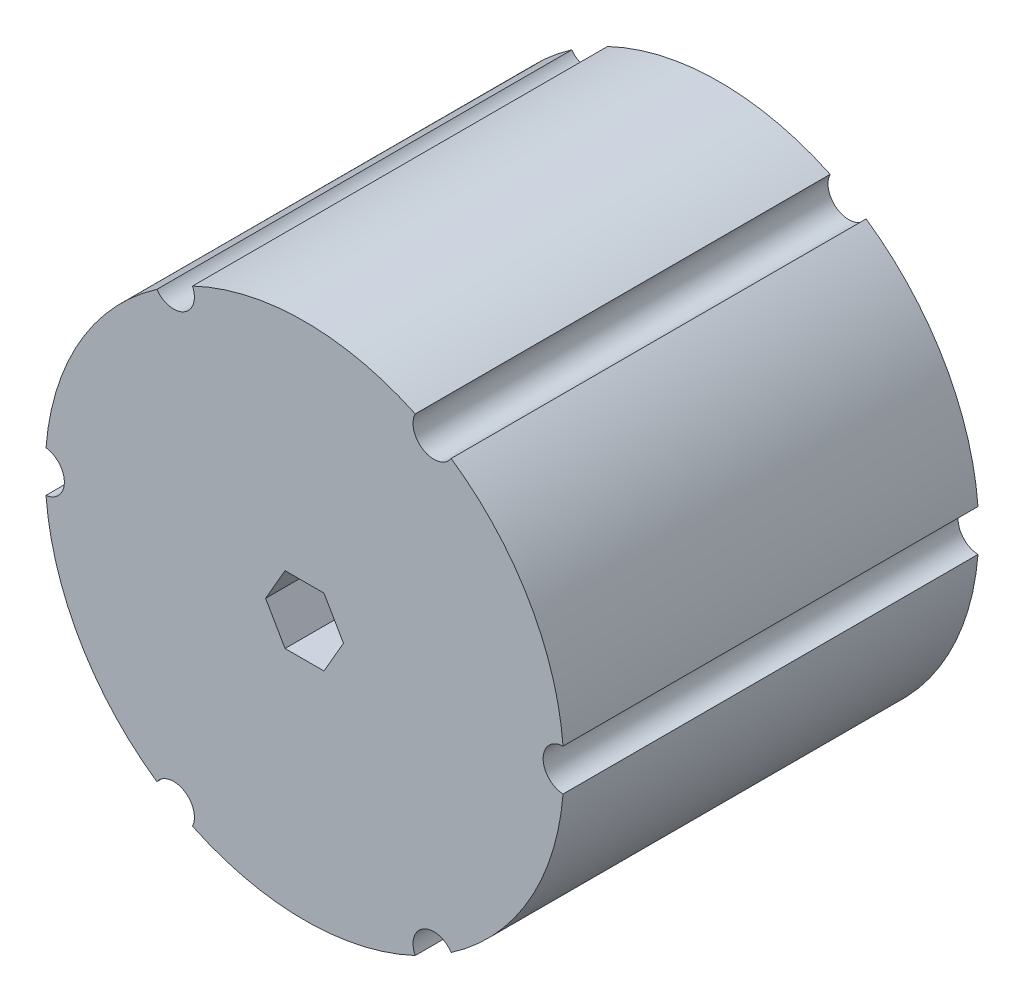
ISO-10303-21;
HEADER;
FILE_DESCRIPTION(('STEP AP214'),'2;1');
FILE_NAME('part.step','',(''),(''),'','','');
FILE_SCHEMA(('AUTOMOTIVE_DESIGN { 1 0 10303 214 1 1 1 1 }'));
ENDSEC;
DATA;
#1=APPLICATION_CONTEXT('core data for automotive mechanical design processes');
#2=APPLICATION_PROTOCOL_DEFINITION('international standard','automotive_design',2000,#1);
#3=PRODUCT_CONTEXT('',#1,'mechanical');
#4=PRODUCT('Part','Part','',(#3));
#5=PRODUCT_RELATED_PRODUCT_CATEGORY('part','',(#4));
#6=PRODUCT_DEFINITION_FORMATION('','',#4);
#7=PRODUCT_DEFINITION_CONTEXT('part definition',#1,'design');
#8=PRODUCT_DEFINITION('design','',#6,#7);
#9=PRODUCT_DEFINITION_SHAPE('','',#8);
#10=(LENGTH_UNIT() NAMED_UNIT(*) SI_UNIT(.MILLI.,.METRE.));
#11=(NAMED_UNIT(*) PLANE_ANGLE_UNIT() SI_UNIT($,.RADIAN.));
#12=(NAMED_UNIT(*) SI_UNIT($,.STERADIAN.) SOLID_ANGLE_UNIT());
#13=UNCERTAINTY_MEASURE_WITH_UNIT(LENGTH_MEASURE(1.E-05),#10,'distance_accuracy_value','');
#14=(GEOMETRIC_REPRESENTATION_CONTEXT(3) GLOBAL_UNCERTAINTY_ASSIGNED_CONTEXT((#13)) GLOBAL_UNIT_ASSIGNED_CONTEXT((#10,
#11,#12)) REPRESENTATION_CONTEXT('',''));
#15=CARTESIAN_POINT('',(0.,0.,0.));
#16=DIRECTION('',(0.,0.,1.));
#17=DIRECTION('',(1.,0.,0.));
#18=AXIS2_PLACEMENT_3D('',#15,#16,#17);
#19=CARTESIAN_POINT('',(0.,0.,-40.));
#20=DIRECTION('',(0.,0.,1.));
#21=DIRECTION('',(1.,0.,0.));
#22=AXIS2_PLACEMENT_3D('',#19,#20,#21);
#23=CYLINDRICAL_SURFACE('',#22,25.);
#24=CARTESIAN_POINT('',(0.,0.,0.));
#25=DIRECTION('',(0.,0.,1.));
#26=DIRECTION('',(1.,0.,0.));
#27=AXIS2_PLACEMENT_3D('',#24,#25,#26);
#28=CIRCLE('',#27,25.);
#29=CARTESIAN_POINT('',(14.1348332513501,-20.620535612746,0.));
#30=VERTEX_POINT('',#29);
#31=CARTESIAN_POINT('',(24.92,-1.99839935948751,0.));
#32=VERTEX_POINT('',#31);
#33=EDGE_CURVE('E272',#30,#32,#28,.T.);
#34=ORIENTED_EDGE('',*,*,#33,.F.);
#35=DIRECTION('',(0.,0.,-1.));
#36=VECTOR('',#35,1.);
#37=CARTESIAN_POINT('',(14.1348332513501,-20.620535612746,-101.488964917374));
#38=LINE('',#37,#36);
#39=CARTESIAN_POINT('',(14.1348332513501,-20.620535612746,-40.));
#40=VERTEX_POINT('',#39);
#41=EDGE_CURVE('E225',#30,#40,#38,.T.);
#42=ORIENTED_EDGE('',*,*,#41,.T.);
#43=CARTESIAN_POINT('',(0.,0.,-40.));
#44=DIRECTION('',(0.,0.,1.));
#45=DIRECTION('',(1.,0.,0.));
#46=AXIS2_PLACEMENT_3D('',#43,#44,#45);
#47=CIRCLE('',#46,25.);
#48=CARTESIAN_POINT('',(24.92,-1.99839935948751,-40.));
#49=VERTEX_POINT('',#48);
#50=EDGE_CURVE('E278',#40,#49,#47,.T.);
#51=ORIENTED_EDGE('',*,*,#50,.T.);
#52=DIRECTION('',(0.,0.,-1.));
#53=VECTOR('',#52,1.);
#54=CARTESIAN_POINT('',(24.92,-1.99839935948749,0.));
#55=LINE('',#54,#53);
#56=EDGE_CURVE('E264',#32,#49,#55,.T.);
#57=ORIENTED_EDGE('',*,*,#56,.F.);
#58=EDGE_LOOP('',(#34,#42,#51,#57));
#59=FACE_BOUND('',#58,.T.);
#60=ADVANCED_FACE('F39',(#59),#23,.T.);
#61=CARTESIAN_POINT('',(-10.7956660067427,-22.5489156162964,-40.));
#62=VERTEX_POINT('',#61);
#63=CARTESIAN_POINT('',(10.6715203746854,-22.6079334060562,-40.));
#64=VERTEX_POINT('',#63);
#65=EDGE_CURVE('E300',#62,#64,#47,.T.);
#66=ORIENTED_EDGE('',*,*,#65,.T.);
#67=DIRECTION('',(0.,0.,-1.));
#68=VECTOR('',#67,1.);
#69=CARTESIAN_POINT('',(10.6715203746854,-22.6079334060562,-101.488964917374));
#70=LINE('',#69,#68);
#71=CARTESIAN_POINT('',(10.6715203746854,-22.6079334060562,0.));
#72=VERTEX_POINT('',#71);
#73=EDGE_CURVE('E223',#64,#72,#70,.F.);
#74=ORIENTED_EDGE('',*,*,#73,.T.);
#75=CARTESIAN_POINT('',(-10.7956660067427,-22.5489156162964,0.));
#76=VERTEX_POINT('',#75);
#77=EDGE_CURVE('E335',#76,#72,#28,.T.);
#78=ORIENTED_EDGE('',*,*,#77,.F.);
#79=DIRECTION('',(0.,0.,-1.));
#80=VECTOR('',#79,1.);
#81=CARTESIAN_POINT('',(-10.7956660067428,-22.5489156162964,-101.488964917374));
#82=LINE('',#81,#80);
#83=EDGE_CURVE('E233',#76,#62,#82,.T.);
#84=ORIENTED_EDGE('',*,*,#83,.T.);
#85=EDGE_LOOP('',(#66,#74,#78,#84));
#86=FACE_BOUND('',#85,.T.);
#87=ADVANCED_FACE('F339',(#86),#23,.T.);
#88=CARTESIAN_POINT('',(0.,0.,0.));
#89=DIRECTION('',(0.,0.,1.));
#90=DIRECTION('',(1.,0.,0.));
#91=AXIS2_PLACEMENT_3D('',#88,#89,#90);
#92=PLANE('',#91);
#93=DIRECTION('',(0.5,0.866025403784439,0.));
#94=VECTOR('',#93,1.);
#95=CARTESIAN_POINT('',(1.87638837486628,-3.25,0.));
#96=LINE('',#95,#94);
#97=CARTESIAN_POINT('',(1.87638837486628,-3.25,0.));
#98=VERTEX_POINT('',#97);
#99=CARTESIAN_POINT('',(3.75277674973257,0.,0.));
#100=VERTEX_POINT('',#99);
#101=EDGE_CURVE('E53',#98,#100,#96,.T.);
#102=ORIENTED_EDGE('',*,*,#101,.F.);
#103=DIRECTION('',(1.,0.,0.));
#104=VECTOR('',#103,1.);
#105=CARTESIAN_POINT('',(-1.87638837486628,-3.25,0.));
#106=LINE('',#105,#104);
#107=CARTESIAN_POINT('',(-1.87638837486628,-3.25,0.));
#108=VERTEX_POINT('',#107);
#109=EDGE_CURVE('E185',#108,#98,#106,.T.);
#110=ORIENTED_EDGE('',*,*,#109,.F.);
#111=DIRECTION('',(0.5,-0.866025403784439,0.));
#112=VECTOR('',#111,1.);
#113=CARTESIAN_POINT('',(-3.75277674973257,0.,0.));
#114=LINE('',#113,#112);
#115=CARTESIAN_POINT('',(-3.75277674973257,0.,0.));
#116=VERTEX_POINT('',#115);
#117=EDGE_CURVE('E188',#116,#108,#114,.T.);
#118=ORIENTED_EDGE('',*,*,#117,.F.);
#119=DIRECTION('',(-0.5,-0.866025403784439,0.));
#120=VECTOR('',#119,1.);
#121=CARTESIAN_POINT('',(-1.87638837486628,3.25,0.));
#122=LINE('',#121,#120);
#123=CARTESIAN_POINT('',(-1.87638837486628,3.25,0.));
#124=VERTEX_POINT('',#123);
#125=EDGE_CURVE('E208',#124,#116,#122,.T.);
#126=ORIENTED_EDGE('',*,*,#125,.F.);
#127=DIRECTION('',(-1.,0.,0.));
#128=VECTOR('',#127,1.);
#129=CARTESIAN_POINT('',(1.87638837486628,3.25,0.));
#130=LINE('',#129,#128);
#131=CARTESIAN_POINT('',(1.87638837486628,3.25,0.));
#132=VERTEX_POINT('',#131);
#133=EDGE_CURVE('E205',#132,#124,#130,.T.);
#134=ORIENTED_EDGE('',*,*,#133,.F.);
#135=DIRECTION('',(-0.5,0.866025403784439,0.));
#136=VECTOR('',#135,1.);
#137=CARTESIAN_POINT('',(3.75277674973257,0.,0.));
#138=LINE('',#137,#136);
#139=EDGE_CURVE('E202',#100,#132,#138,.T.);
#140=ORIENTED_EDGE('',*,*,#139,.F.);
#141=EDGE_LOOP('',(#102,#110,#118,#126,#134,#140));
#142=FACE_BOUND('',#141,.T.);
#143=CARTESIAN_POINT('',(12.4619168429844,-21.7165970574748,0.));
#144=DIRECTION('',(0.,0.,1.));
#145=DIRECTION('',(0.50000000000001,-0.866025403784433,0.));
#146=AXIS2_PLACEMENT_3D('',#143,#144,#145);
#147=CIRCLE('',#146,2.);
#148=EDGE_CURVE('E61',#30,#72,#147,.T.);
#149=ORIENTED_EDGE('',*,*,#148,.F.);
#150=ORIENTED_EDGE('',*,*,#33,.T.);
#151=CARTESIAN_POINT('',(25.,0.,0.));
#152=DIRECTION('',(0.,0.,1.));
#153=DIRECTION('',(1.,0.,0.));
#154=AXIS2_PLACEMENT_3D('',#151,#152,#153);
#155=CIRCLE('',#154,2.);
#156=CARTESIAN_POINT('',(24.92,1.99839935948751,0.));
#157=VERTEX_POINT('',#156);
#158=EDGE_CURVE('E261',#157,#32,#155,.T.);
#159=ORIENTED_EDGE('',*,*,#158,.F.);
#160=CARTESIAN_POINT('',(14.1348332513498,20.6205356127462,0.));
#161=VERTEX_POINT('',#160);
#162=EDGE_CURVE('E279',#157,#161,#28,.T.);
#163=ORIENTED_EDGE('',*,*,#162,.T.);
#164=CARTESIAN_POINT('',(12.4619168429841,21.7165970574749,0.));
#165=DIRECTION('',(0.,0.,1.));
#166=DIRECTION('',(0.499999999999998,0.86602540378444,0.));
#167=AXIS2_PLACEMENT_3D('',#164,#165,#166);
#168=CIRCLE('',#167,2.);
#169=CARTESIAN_POINT('',(10.6715203746851,22.6079334060563,0.));
#170=VERTEX_POINT('',#169);
#171=EDGE_CURVE('E252',#170,#161,#168,.T.);
#172=ORIENTED_EDGE('',*,*,#171,.F.);
#173=CARTESIAN_POINT('',(-10.795666006743,22.5489156162963,0.));
#174=VERTEX_POINT('',#173);
#175=EDGE_CURVE('E282',#170,#174,#28,.T.);
#176=ORIENTED_EDGE('',*,*,#175,.T.);
#177=CARTESIAN_POINT('',(-12.6142494710475,21.7165970574749,0.));
#178=DIRECTION('',(0.,0.,1.));
#179=DIRECTION('',(-0.500000000000004,0.866025403784436,0.));
#180=AXIS2_PLACEMENT_3D('',#177,#178,#179);
#181=CIRCLE('',#180,2.);
#182=CARTESIAN_POINT('',(-14.2382407554506,20.5492700646477,0.));
#183=VERTEX_POINT('',#182);
#184=EDGE_CURVE('E244',#183,#174,#181,.T.);
#185=ORIENTED_EDGE('',*,*,#184,.F.);
#186=CARTESIAN_POINT('',(-24.9209458059172,1.98656994302669,0.));
#187=VERTEX_POINT('',#186);
#188=EDGE_CURVE('E331',#183,#187,#28,.T.);
#189=ORIENTED_EDGE('',*,*,#188,.T.);
#190=CARTESIAN_POINT('',(-25.1523326280632,0.,0.));
#191=DIRECTION('',(0.,0.,1.));
#192=DIRECTION('',(-1.,0.,0.));
#193=AXIS2_PLACEMENT_3D('',#190,#191,#192);
#194=CIRCLE('',#193,2.);
#195=CARTESIAN_POINT('',(-24.9209458059172,-1.9865699430267,0.));
#196=VERTEX_POINT('',#195);
#197=EDGE_CURVE('E236',#196,#187,#194,.T.);
#198=ORIENTED_EDGE('',*,*,#197,.F.);
#199=CARTESIAN_POINT('',(-14.2382407554503,-20.5492700646479,0.));
#200=VERTEX_POINT('',#199);
#201=EDGE_CURVE('E333',#196,#200,#28,.T.);
#202=ORIENTED_EDGE('',*,*,#201,.T.);
#203=CARTESIAN_POINT('',(-12.6142494710472,-21.716597057475,0.));
#204=DIRECTION('',(0.,0.,1.));
#205=DIRECTION('',(-0.499999999999992,-0.866025403784443,0.));
#206=AXIS2_PLACEMENT_3D('',#203,#204,#205);
#207=CIRCLE('',#206,2.);
#208=EDGE_CURVE('E228',#76,#200,#207,.T.);
#209=ORIENTED_EDGE('',*,*,#208,.F.);
#210=ORIENTED_EDGE('',*,*,#77,.T.);
#211=EDGE_LOOP('',(#149,#150,#159,#163,#172,#176,#185,#189,#198,#202,#209,#210));
#212=FACE_BOUND('',#211,.T.);
#213=ADVANCED_FACE('F318',(#142,#212),#92,.T.);
#214=CARTESIAN_POINT('',(-24.9209458059172,-1.9865699430267,-40.));
#215=VERTEX_POINT('',#214);
#216=CARTESIAN_POINT('',(-14.2382407554503,-20.5492700646479,-40.));
#217=VERTEX_POINT('',#216);
#218=EDGE_CURVE('E298',#215,#217,#47,.T.);
#219=ORIENTED_EDGE('',*,*,#218,.T.);
#220=DIRECTION('',(0.,0.,-1.));
#221=VECTOR('',#220,1.);
#222=CARTESIAN_POINT('',(-14.2382407554502,-20.5492700646479,-101.488964917374));
#223=LINE('',#222,#221);
#224=EDGE_CURVE('E231',#217,#200,#223,.F.);
#225=ORIENTED_EDGE('',*,*,#224,.T.);
#226=ORIENTED_EDGE('',*,*,#201,.F.);
#227=DIRECTION('',(0.,0.,-1.));
#228=VECTOR('',#227,1.);
#229=CARTESIAN_POINT('',(-24.9209458059172,-1.98656994302672,-101.488964917374));
#230=LINE('',#229,#228);
#231=EDGE_CURVE('E241',#196,#215,#230,.T.);
#232=ORIENTED_EDGE('',*,*,#231,.T.);
#233=EDGE_LOOP('',(#219,#225,#226,#232));
#234=FACE_BOUND('',#233,.T.);
#235=ADVANCED_FACE('F302',(#234),#23,.T.);
#236=CARTESIAN_POINT('',(-14.2382407554506,20.5492700646477,-40.));
#237=VERTEX_POINT('',#236);
#238=CARTESIAN_POINT('',(-24.9209458059172,1.98656994302669,-40.));
#239=VERTEX_POINT('',#238);
#240=EDGE_CURVE('E306',#237,#239,#47,.T.);
#241=ORIENTED_EDGE('',*,*,#240,.T.);
#242=DIRECTION('',(0.,0.,-1.));
#243=VECTOR('',#242,1.);
#244=CARTESIAN_POINT('',(-24.9209458059172,1.98656994302672,-101.488964917374));
#245=LINE('',#244,#243);
#246=EDGE_CURVE('E239',#239,#187,#245,.F.);
#247=ORIENTED_EDGE('',*,*,#246,.T.);
#248=ORIENTED_EDGE('',*,*,#188,.F.);
#249=DIRECTION('',(0.,0.,-1.));
#250=VECTOR('',#249,1.);
#251=CARTESIAN_POINT('',(-14.2382407554505,20.5492700646477,-101.488964917374));
#252=LINE('',#251,#250);
#253=EDGE_CURVE('E249',#183,#237,#252,.T.);
#254=ORIENTED_EDGE('',*,*,#253,.T.);
#255=EDGE_LOOP('',(#241,#247,#248,#254));
#256=FACE_BOUND('',#255,.T.);
#257=ADVANCED_FACE('F347',(#256),#23,.T.);
#258=CARTESIAN_POINT('',(10.6715203746851,22.6079334060563,-40.));
#259=VERTEX_POINT('',#258);
#260=CARTESIAN_POINT('',(-10.795666006743,22.5489156162963,-40.));
#261=VERTEX_POINT('',#260);
#262=EDGE_CURVE('E277',#259,#261,#47,.T.);
#263=ORIENTED_EDGE('',*,*,#262,.T.);
#264=DIRECTION('',(0.,0.,-1.));
#265=VECTOR('',#264,1.);
#266=CARTESIAN_POINT('',(-10.7956660067431,22.5489156162963,-101.488964917374));
#267=LINE('',#266,#265);
#268=EDGE_CURVE('E247',#261,#174,#267,.F.);
#269=ORIENTED_EDGE('',*,*,#268,.T.);
#270=ORIENTED_EDGE('',*,*,#175,.F.);
#271=DIRECTION('',(0.,0.,-1.));
#272=VECTOR('',#271,1.);
#273=CARTESIAN_POINT('',(10.6715203746851,22.6079334060563,-101.488964917374));
#274=LINE('',#273,#272);
#275=EDGE_CURVE('E257',#170,#259,#274,.T.);
#276=ORIENTED_EDGE('',*,*,#275,.T.);
#277=EDGE_LOOP('',(#263,#269,#270,#276));
#278=FACE_BOUND('',#277,.T.);
#279=ADVANCED_FACE('F329',(#278),#23,.T.);
#280=CARTESIAN_POINT('',(24.92,1.99839935948749,-40.));
#281=VERTEX_POINT('',#280);
#282=CARTESIAN_POINT('',(14.1348332513498,20.6205356127462,-40.));
#283=VERTEX_POINT('',#282);
#284=EDGE_CURVE('E273',#281,#283,#47,.T.);
#285=ORIENTED_EDGE('',*,*,#284,.T.);
#286=DIRECTION('',(0.,0.,-1.));
#287=VECTOR('',#286,1.);
#288=CARTESIAN_POINT('',(14.1348332513498,20.6205356127462,-101.488964917374));
#289=LINE('',#288,#287);
#290=EDGE_CURVE('E255',#283,#161,#289,.F.);
#291=ORIENTED_EDGE('',*,*,#290,.T.);
#292=ORIENTED_EDGE('',*,*,#162,.F.);
#293=DIRECTION('',(0.,0.,-1.));
#294=VECTOR('',#293,1.);
#295=CARTESIAN_POINT('',(24.92,1.99839935948749,0.));
#296=LINE('',#295,#294);
#297=EDGE_CURVE('E260',#157,#281,#296,.T.);
#298=ORIENTED_EDGE('',*,*,#297,.T.);
#299=EDGE_LOOP('',(#285,#291,#292,#298));
#300=FACE_BOUND('',#299,.T.);
#301=ADVANCED_FACE('F320',(#300),#23,.T.);
#302=CARTESIAN_POINT('',(0.,0.,-40.));
#303=DIRECTION('',(0.,0.,1.));
#304=DIRECTION('',(1.,0.,0.));
#305=AXIS2_PLACEMENT_3D('',#302,#303,#304);
#306=PLANE('',#305);
#307=CARTESIAN_POINT('',(0.,0.,-40.));
#308=DIRECTION('',(0.,0.,-1.));
#309=DIRECTION('',(-1.,0.,0.));
#310=AXIS2_PLACEMENT_3D('',#307,#308,#309);
#311=CIRCLE('',#310,2.05);
#312=CARTESIAN_POINT('',(-2.05,0.,-40.));
#313=VERTEX_POINT('',#312);
#314=EDGE_CURVE('E191',#313,#313,#311,.T.);
#315=ORIENTED_EDGE('',*,*,#314,.F.);
#316=EDGE_LOOP('',(#315));
#317=FACE_BOUND('',#316,.T.);
#318=CARTESIAN_POINT('',(12.4619168429844,-21.7165970574748,-40.));
#319=DIRECTION('',(0.,0.,1.));
#320=DIRECTION('',(1.,0.,0.));
#321=AXIS2_PLACEMENT_3D('',#318,#319,#320);
#322=CIRCLE('',#321,2.);
#323=EDGE_CURVE('E11',#64,#40,#322,.F.);
#324=ORIENTED_EDGE('',*,*,#323,.F.);
#325=ORIENTED_EDGE('',*,*,#65,.F.);
#326=CARTESIAN_POINT('',(-12.6142494710472,-21.716597057475,-40.));
#327=DIRECTION('',(0.,0.,1.));
#328=DIRECTION('',(1.,0.,0.));
#329=AXIS2_PLACEMENT_3D('',#326,#327,#328);
#330=CIRCLE('',#329,2.);
#331=EDGE_CURVE('E46',#217,#62,#330,.F.);
#332=ORIENTED_EDGE('',*,*,#331,.F.);
#333=ORIENTED_EDGE('',*,*,#218,.F.);
#334=CARTESIAN_POINT('',(-25.1523326280632,0.,-40.));
#335=DIRECTION('',(0.,0.,1.));
#336=DIRECTION('',(1.,0.,0.));
#337=AXIS2_PLACEMENT_3D('',#334,#335,#336);
#338=CIRCLE('',#337,2.);
#339=EDGE_CURVE('E288',#239,#215,#338,.F.);
#340=ORIENTED_EDGE('',*,*,#339,.F.);
#341=ORIENTED_EDGE('',*,*,#240,.F.);
#342=CARTESIAN_POINT('',(-12.6142494710475,21.7165970574749,-40.));
#343=DIRECTION('',(0.,0.,1.));
#344=DIRECTION('',(1.,0.,0.));
#345=AXIS2_PLACEMENT_3D('',#342,#343,#344);
#346=CIRCLE('',#345,2.);
#347=EDGE_CURVE('E285',#261,#237,#346,.F.);
#348=ORIENTED_EDGE('',*,*,#347,.F.);
#349=ORIENTED_EDGE('',*,*,#262,.F.);
#350=CARTESIAN_POINT('',(12.4619168429841,21.7165970574749,-40.));
#351=DIRECTION('',(0.,0.,1.));
#352=DIRECTION('',(1.,0.,0.));
#353=AXIS2_PLACEMENT_3D('',#350,#351,#352);
#354=CIRCLE('',#353,2.);
#355=EDGE_CURVE('E276',#283,#259,#354,.F.);
#356=ORIENTED_EDGE('',*,*,#355,.F.);
#357=ORIENTED_EDGE('',*,*,#284,.F.);
#358=CARTESIAN_POINT('',(25.,0.,-40.));
#359=DIRECTION('',(0.,0.,1.));
#360=DIRECTION('',(1.,0.,0.));
#361=AXIS2_PLACEMENT_3D('',#358,#359,#360);
#362=CIRCLE('',#361,2.);
#363=EDGE_CURVE('E267',#49,#281,#362,.F.);
#364=ORIENTED_EDGE('',*,*,#363,.F.);
#365=ORIENTED_EDGE('',*,*,#50,.F.);
#366=EDGE_LOOP('',(#324,#325,#332,#333,#340,#341,#348,#349,#356,#357,#364,#365));
#367=FACE_BOUND('',#366,.T.);
#368=ADVANCED_FACE('F297',(#317,#367),#306,.F.);
#369=CARTESIAN_POINT('',(25.,0.,0.));
#370=DIRECTION('',(0.,0.,-1.));
#371=DIRECTION('',(-1.,0.,0.));
#372=AXIS2_PLACEMENT_3D('',#369,#370,#371);
#373=CYLINDRICAL_SURFACE('',#372,2.);
#374=ORIENTED_EDGE('',*,*,#56,.T.);
#375=ORIENTED_EDGE('',*,*,#363,.T.);
#376=ORIENTED_EDGE('',*,*,#297,.F.);
#377=ORIENTED_EDGE('',*,*,#158,.T.);
#378=EDGE_LOOP('',(#374,#375,#376,#377));
#379=FACE_BOUND('',#378,.T.);
#380=ADVANCED_FACE('F316',(#379),#373,.F.);
#381=CARTESIAN_POINT('',(12.4619168429841,21.7165970574749,0.));
#382=DIRECTION('',(0.,0.,-1.));
#383=DIRECTION('',(-1.,0.,0.));
#384=AXIS2_PLACEMENT_3D('',#381,#382,#383);
#385=CYLINDRICAL_SURFACE('',#384,2.);
#386=ORIENTED_EDGE('',*,*,#275,.F.);
#387=ORIENTED_EDGE('',*,*,#171,.T.);
#388=ORIENTED_EDGE('',*,*,#290,.F.);
#389=ORIENTED_EDGE('',*,*,#355,.T.);
#390=EDGE_LOOP('',(#386,#387,#388,#389));
#391=FACE_BOUND('',#390,.T.);
#392=ADVANCED_FACE('F324',(#391),#385,.F.);
#393=CARTESIAN_POINT('',(-12.6142494710475,21.7165970574749,0.));
#394=DIRECTION('',(0.,0.,-1.));
#395=DIRECTION('',(-1.,0.,0.));
#396=AXIS2_PLACEMENT_3D('',#393,#394,#395);
#397=CYLINDRICAL_SURFACE('',#396,2.);
#398=ORIENTED_EDGE('',*,*,#253,.F.);
#399=ORIENTED_EDGE('',*,*,#184,.T.);
#400=ORIENTED_EDGE('',*,*,#268,.F.);
#401=ORIENTED_EDGE('',*,*,#347,.T.);
#402=EDGE_LOOP('',(#398,#399,#400,#401));
#403=FACE_BOUND('',#402,.T.);
#404=ADVANCED_FACE('F360',(#403),#397,.F.);
#405=CARTESIAN_POINT('',(-25.1523326280632,0.,0.));
#406=DIRECTION('',(0.,0.,-1.));
#407=DIRECTION('',(-1.,0.,0.));
#408=AXIS2_PLACEMENT_3D('',#405,#406,#407);
#409=CYLINDRICAL_SURFACE('',#408,2.);
#410=ORIENTED_EDGE('',*,*,#231,.F.);
#411=ORIENTED_EDGE('',*,*,#197,.T.);
#412=ORIENTED_EDGE('',*,*,#246,.F.);
#413=ORIENTED_EDGE('',*,*,#339,.T.);
#414=EDGE_LOOP('',(#410,#411,#412,#413));
#415=FACE_BOUND('',#414,.T.);
#416=ADVANCED_FACE('F358',(#415),#409,.F.);
#417=CARTESIAN_POINT('',(-12.6142494710472,-21.716597057475,0.));
#418=DIRECTION('',(0.,0.,-1.));
#419=DIRECTION('',(-1.,0.,0.));
#420=AXIS2_PLACEMENT_3D('',#417,#418,#419);
#421=CYLINDRICAL_SURFACE('',#420,2.);
#422=ORIENTED_EDGE('',*,*,#83,.F.);
#423=ORIENTED_EDGE('',*,*,#208,.T.);
#424=ORIENTED_EDGE('',*,*,#224,.F.);
#425=ORIENTED_EDGE('',*,*,#331,.T.);
#426=EDGE_LOOP('',(#422,#423,#424,#425));
#427=FACE_BOUND('',#426,.T.);
#428=ADVANCED_FACE('F294',(#427),#421,.F.);
#429=CARTESIAN_POINT('',(12.4619168429844,-21.7165970574748,0.));
#430=DIRECTION('',(0.,0.,-1.));
#431=DIRECTION('',(-1.,0.,0.));
#432=AXIS2_PLACEMENT_3D('',#429,#430,#431);
#433=CYLINDRICAL_SURFACE('',#432,2.);
#434=ORIENTED_EDGE('',*,*,#41,.F.);
#435=ORIENTED_EDGE('',*,*,#148,.T.);
#436=ORIENTED_EDGE('',*,*,#73,.F.);
#437=ORIENTED_EDGE('',*,*,#323,.T.);
#438=EDGE_LOOP('',(#434,#435,#436,#437));
#439=FACE_BOUND('',#438,.T.);
#440=ADVANCED_FACE('F338',(#439),#433,.F.);
#441=CARTESIAN_POINT('',(1.87638837486628,-3.25,-10.));
#442=DIRECTION('',(0.866025403784439,-0.5,0.));
#443=DIRECTION('',(0.5,0.866025403784439,0.));
#444=AXIS2_PLACEMENT_3D('',#441,#442,#443);
#445=PLANE('',#444);
#446=ORIENTED_EDGE('',*,*,#101,.T.);
#447=DIRECTION('',(0.,0.,1.));
#448=VECTOR('',#447,1.);
#449=CARTESIAN_POINT('',(3.75277674973257,0.,-10.));
#450=LINE('',#449,#448);
#451=CARTESIAN_POINT('',(3.75277674973257,0.,-10.));
#452=VERTEX_POINT('',#451);
#453=EDGE_CURVE('E162',#452,#100,#450,.T.);
#454=ORIENTED_EDGE('',*,*,#453,.F.);
#455=DIRECTION('',(0.5,0.866025403784439,0.));
#456=VECTOR('',#455,1.);
#457=CARTESIAN_POINT('',(1.87638837486628,-3.25,-10.));
#458=LINE('',#457,#456);
#459=CARTESIAN_POINT('',(1.87638837486628,-3.25,-10.));
#460=VERTEX_POINT('',#459);
#461=EDGE_CURVE('E166',#460,#452,#458,.T.);
#462=ORIENTED_EDGE('',*,*,#461,.F.);
#463=DIRECTION('',(0.,0.,1.));
#464=VECTOR('',#463,1.);
#465=CARTESIAN_POINT('',(1.87638837486628,-3.25,-10.));
#466=LINE('',#465,#464);
#467=EDGE_CURVE('E213',#460,#98,#466,.T.);
#468=ORIENTED_EDGE('',*,*,#467,.T.);
#469=EDGE_LOOP('',(#446,#454,#462,#468));
#470=FACE_BOUND('',#469,.T.);
#471=ADVANCED_FACE('F164',(#470),#445,.F.);
#472=CARTESIAN_POINT('',(-1.87638837486628,-3.25,-10.));
#473=DIRECTION('',(0.,-1.,0.));
#474=DIRECTION('',(0.,0.,-1.));
#475=AXIS2_PLACEMENT_3D('',#472,#473,#474);
#476=PLANE('',#475);
#477=ORIENTED_EDGE('',*,*,#109,.T.);
#478=ORIENTED_EDGE('',*,*,#467,.F.);
#479=DIRECTION('',(1.,0.,0.));
#480=VECTOR('',#479,1.);
#481=CARTESIAN_POINT('',(-1.87638837486628,-3.25,-10.));
#482=LINE('',#481,#480);
#483=CARTESIAN_POINT('',(-1.87638837486628,-3.25,-10.));
#484=VERTEX_POINT('',#483);
#485=EDGE_CURVE('E172',#484,#460,#482,.T.);
#486=ORIENTED_EDGE('',*,*,#485,.F.);
#487=DIRECTION('',(0.,0.,1.));
#488=VECTOR('',#487,1.);
#489=CARTESIAN_POINT('',(-1.87638837486628,-3.25,-10.));
#490=LINE('',#489,#488);
#491=EDGE_CURVE('E215',#484,#108,#490,.T.);
#492=ORIENTED_EDGE('',*,*,#491,.T.);
#493=EDGE_LOOP('',(#477,#478,#486,#492));
#494=FACE_BOUND('',#493,.T.);
#495=ADVANCED_FACE('F398',(#494),#476,.F.);
#496=CARTESIAN_POINT('',(-3.75277674973257,0.,-10.));
#497=DIRECTION('',(-0.866025403784438,-0.5,0.));
#498=DIRECTION('',(0.5,-0.866025403784439,0.));
#499=AXIS2_PLACEMENT_3D('',#496,#497,#498);
#500=PLANE('',#499);
#501=ORIENTED_EDGE('',*,*,#117,.T.);
#502=ORIENTED_EDGE('',*,*,#491,.F.);
#503=DIRECTION('',(0.5,-0.866025403784439,0.));
#504=VECTOR('',#503,1.);
#505=CARTESIAN_POINT('',(-3.75277674973257,0.,-10.));
#506=LINE('',#505,#504);
#507=CARTESIAN_POINT('',(-3.75277674973257,0.,-10.));
#508=VERTEX_POINT('',#507);
#509=EDGE_CURVE('E198',#508,#484,#506,.T.);
#510=ORIENTED_EDGE('',*,*,#509,.F.);
#511=DIRECTION('',(0.,0.,1.));
#512=VECTOR('',#511,1.);
#513=CARTESIAN_POINT('',(-3.75277674973257,0.,-10.));
#514=LINE('',#513,#512);
#515=EDGE_CURVE('E217',#508,#116,#514,.T.);
#516=ORIENTED_EDGE('',*,*,#515,.T.);
#517=EDGE_LOOP('',(#501,#502,#510,#516));
#518=FACE_BOUND('',#517,.T.);
#519=ADVANCED_FACE('F401',(#518),#500,.F.);
#520=CARTESIAN_POINT('',(-1.87638837486628,3.25,-10.));
#521=DIRECTION('',(-0.866025403784439,0.5,0.));
#522=DIRECTION('',(-0.5,-0.866025403784439,0.));
#523=AXIS2_PLACEMENT_3D('',#520,#521,#522);
#524=PLANE('',#523);
#525=ORIENTED_EDGE('',*,*,#125,.T.);
#526=ORIENTED_EDGE('',*,*,#515,.F.);
#527=DIRECTION('',(-0.5,-0.866025403784439,0.));
#528=VECTOR('',#527,1.);
#529=CARTESIAN_POINT('',(-1.87638837486628,3.25,-10.));
#530=LINE('',#529,#528);
#531=CARTESIAN_POINT('',(-1.87638837486628,3.25,-10.));
#532=VERTEX_POINT('',#531);
#533=EDGE_CURVE('E195',#532,#508,#530,.T.);
#534=ORIENTED_EDGE('',*,*,#533,.F.);
#535=DIRECTION('',(0.,0.,1.));
#536=VECTOR('',#535,1.);
#537=CARTESIAN_POINT('',(-1.87638837486628,3.25,-10.));
#538=LINE('',#537,#536);
#539=EDGE_CURVE('E219',#532,#124,#538,.T.);
#540=ORIENTED_EDGE('',*,*,#539,.T.);
#541=EDGE_LOOP('',(#525,#526,#534,#540));
#542=FACE_BOUND('',#541,.T.);
#543=ADVANCED_FACE('F405',(#542),#524,.F.);
#544=CARTESIAN_POINT('',(1.87638837486628,3.25,-10.));
#545=DIRECTION('',(0.,1.,0.));
#546=DIRECTION('',(-1.,0.,0.));
#547=AXIS2_PLACEMENT_3D('',#544,#545,#546);
#548=PLANE('',#547);
#549=ORIENTED_EDGE('',*,*,#133,.T.);
#550=ORIENTED_EDGE('',*,*,#539,.F.);
#551=DIRECTION('',(-1.,0.,0.));
#552=VECTOR('',#551,1.);
#553=CARTESIAN_POINT('',(1.87638837486628,3.25,-10.));
#554=LINE('',#553,#552);
#555=CARTESIAN_POINT('',(1.87638837486628,3.25,-10.));
#556=VERTEX_POINT('',#555);
#557=EDGE_CURVE('E180',#556,#532,#554,.T.);
#558=ORIENTED_EDGE('',*,*,#557,.F.);
#559=DIRECTION('',(0.,0.,1.));
#560=VECTOR('',#559,1.);
#561=CARTESIAN_POINT('',(1.87638837486628,3.25,-10.));
#562=LINE('',#561,#560);
#563=EDGE_CURVE('E171',#556,#132,#562,.T.);
#564=ORIENTED_EDGE('',*,*,#563,.T.);
#565=EDGE_LOOP('',(#549,#550,#558,#564));
#566=FACE_BOUND('',#565,.T.);
#567=ADVANCED_FACE('F409',(#566),#548,.F.);
#568=CARTESIAN_POINT('',(3.75277674973257,0.,-10.));
#569=DIRECTION('',(0.866025403784438,0.5,0.));
#570=DIRECTION('',(-0.5,0.866025403784439,0.));
#571=AXIS2_PLACEMENT_3D('',#568,#569,#570);
#572=PLANE('',#571);
#573=ORIENTED_EDGE('',*,*,#139,.T.);
#574=ORIENTED_EDGE('',*,*,#563,.F.);
#575=DIRECTION('',(-0.5,0.866025403784439,0.));
#576=VECTOR('',#575,1.);
#577=CARTESIAN_POINT('',(3.75277674973257,0.,-10.));
#578=LINE('',#577,#576);
#579=EDGE_CURVE('E175',#452,#556,#578,.T.);
#580=ORIENTED_EDGE('',*,*,#579,.F.);
#581=ORIENTED_EDGE('',*,*,#453,.T.);
#582=EDGE_LOOP('',(#573,#574,#580,#581));
#583=FACE_BOUND('',#582,.T.);
#584=ADVANCED_FACE('F176',(#583),#572,.F.);
#585=CARTESIAN_POINT('',(0.,0.,-10.));
#586=DIRECTION('',(0.,0.,1.));
#587=DIRECTION('',(1.,0.,0.));
#588=AXIS2_PLACEMENT_3D('',#585,#586,#587);
#589=PLANE('',#588);
#590=ORIENTED_EDGE('',*,*,#461,.T.);
#591=ORIENTED_EDGE('',*,*,#579,.T.);
#592=ORIENTED_EDGE('',*,*,#557,.T.);
#593=ORIENTED_EDGE('',*,*,#533,.T.);
#594=ORIENTED_EDGE('',*,*,#509,.T.);
#595=ORIENTED_EDGE('',*,*,#485,.T.);
#596=EDGE_LOOP('',(#590,#591,#592,#593,#594,#595));
#597=FACE_BOUND('',#596,.T.);
#598=ADVANCED_FACE('F182',(#597),#589,.T.);
#599=CARTESIAN_POINT('',(0.,0.,-30.));
#600=DIRECTION('',(0.,0.,-1.));
#601=DIRECTION('',(-1.,0.,0.));
#602=AXIS2_PLACEMENT_3D('',#599,#600,#601);
#603=CYLINDRICAL_SURFACE('',#602,2.05);
#604=CARTESIAN_POINT('',(0.,0.,-30.));
#605=DIRECTION('',(0.,0.,-1.));
#606=DIRECTION('',(-1.,0.,0.));
#607=AXIS2_PLACEMENT_3D('',#604,#605,#606);
#608=CIRCLE('',#607,2.05);
#609=CARTESIAN_POINT('',(-2.05,0.,-30.));
#610=VERTEX_POINT('',#609);
#611=EDGE_CURVE('E203',#610,#610,#608,.T.);
#612=ORIENTED_EDGE('',*,*,#611,.F.);
#613=EDGE_LOOP('',(#612));
#614=FACE_BOUND('',#613,.T.);
#615=ORIENTED_EDGE('',*,*,#314,.T.);
#616=EDGE_LOOP('',(#615));
#617=FACE_BOUND('',#616,.T.);
#618=ADVANCED_FACE('F390',(#614,#617),#603,.F.);
#619=CARTESIAN_POINT('',(0.,0.,-30.));
#620=DIRECTION('',(0.,0.,-1.));
#621=DIRECTION('',(-1.,0.,0.));
#622=AXIS2_PLACEMENT_3D('',#619,#620,#621);
#623=PLANE('',#622);
#624=ORIENTED_EDGE('',*,*,#611,.T.);
#625=EDGE_LOOP('',(#624));
#626=FACE_BOUND('',#625,.T.);
#627=ADVANCED_FACE('F388',(#626),#623,.T.);
#628=CLOSED_SHELL('',(#60,#87,#213,#235,#257,#279,#301,#368,#380,#392,#404,#416,#428,#440,#471,
#495,#519,#543,#567,#584,#598,#618,#627));
#629=MANIFOLD_SOLID_BREP('B2',#628);
#630=ADVANCED_BREP_SHAPE_REPRESENTATION('',(#18,#629),#14);
#631=SHAPE_DEFINITION_REPRESENTATION(#9,#630);
ENDSEC;
END-ISO-10303-21;
